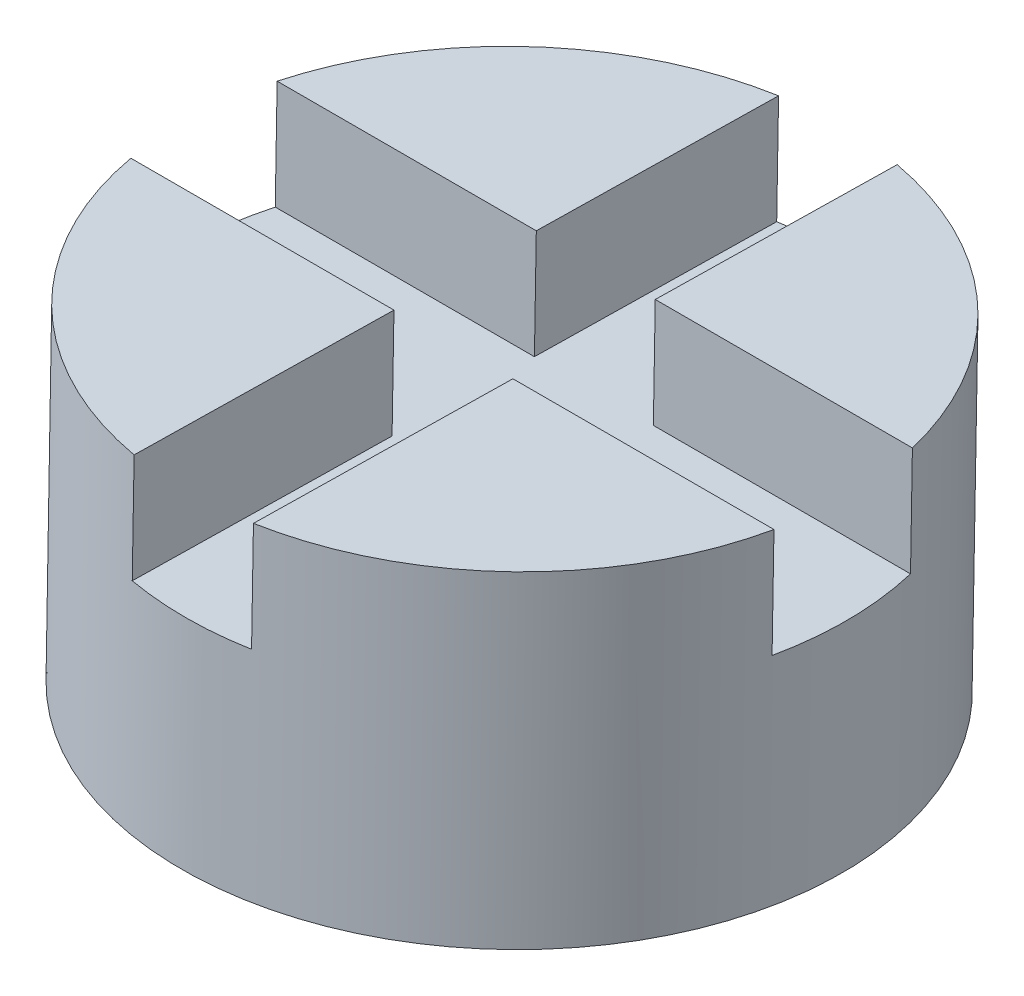
ISO-10303-21;
HEADER;
FILE_DESCRIPTION(('STEP AP214'),'2;1');
FILE_NAME('part.step','',(''),(''),'','','');
FILE_SCHEMA(('AUTOMOTIVE_DESIGN { 1 0 10303 214 1 1 1 1 }'));
ENDSEC;
DATA;
#1=APPLICATION_CONTEXT('core data for automotive mechanical design processes');
#2=APPLICATION_PROTOCOL_DEFINITION('international standard','automotive_design',2000,#1);
#3=PRODUCT_CONTEXT('',#1,'mechanical');
#4=PRODUCT('Part','Part','',(#3));
#5=PRODUCT_RELATED_PRODUCT_CATEGORY('part','',(#4));
#6=PRODUCT_DEFINITION_FORMATION('','',#4);
#7=PRODUCT_DEFINITION_CONTEXT('part definition',#1,'design');
#8=PRODUCT_DEFINITION('design','',#6,#7);
#9=PRODUCT_DEFINITION_SHAPE('','',#8);
#10=(LENGTH_UNIT() NAMED_UNIT(*) SI_UNIT(.MILLI.,.METRE.));
#11=(NAMED_UNIT(*) PLANE_ANGLE_UNIT() SI_UNIT($,.RADIAN.));
#12=(NAMED_UNIT(*) SI_UNIT($,.STERADIAN.) SOLID_ANGLE_UNIT());
#13=UNCERTAINTY_MEASURE_WITH_UNIT(LENGTH_MEASURE(1.E-05),#10,'distance_accuracy_value','');
#14=(GEOMETRIC_REPRESENTATION_CONTEXT(3) GLOBAL_UNCERTAINTY_ASSIGNED_CONTEXT((#13)) GLOBAL_UNIT_ASSIGNED_CONTEXT((#10,
#11,#12)) REPRESENTATION_CONTEXT('',''));
#15=CARTESIAN_POINT('',(0.,0.,0.));
#16=DIRECTION('',(0.,0.,1.));
#17=DIRECTION('',(1.,0.,0.));
#18=AXIS2_PLACEMENT_3D('',#15,#16,#17);
#19=CARTESIAN_POINT('',(0.,42.7310366721,-0.7458730195362));
#20=DIRECTION('',(0.,0.999847695156402,-0.01745240643669));
#21=DIRECTION('',(0.,0.01745240643669,0.999847695156402));
#22=AXIS2_PLACEMENT_3D('',#19,#20,#21);
#23=PLANE('',#22);
#24=DIRECTION('',(1.,0.,0.));
#25=VECTOR('',#24,1.);
#26=CARTESIAN_POINT('',(88.15,42.65438024238,-5.13751693705457));
#27=LINE('',#26,#25);
#28=CARTESIAN_POINT('',(88.15,42.65438024238,-5.13751693705486));
#29=VERTEX_POINT('',#28);
#30=CARTESIAN_POINT('',(85.753357366507,42.6543802423814,-5.1375169370546));
#31=VERTEX_POINT('',#30);
#32=EDGE_CURVE('E183',#29,#31,#27,.F.);
#33=ORIENTED_EDGE('',*,*,#32,.T.);
#34=CARTESIAN_POINT('',(88.69069617612,42.6672853099402,-4.39818611183434));
#35=DIRECTION('',(0.,-0.999847695156402,0.01745240643669));
#36=DIRECTION('',(0.,-0.01745240643669,-0.999847695156402));
#37=AXIS2_PLACEMENT_3D('',#34,#35,#36);
#38=CIRCLE('',#37,3.02898264973);
#39=CARTESIAN_POINT('',(85.7172036385218,42.67735760191,-3.82114489133257));
#40=VERTEX_POINT('',#39);
#41=EDGE_CURVE('E228',#31,#40,#38,.F.);
#42=ORIENTED_EDGE('',*,*,#41,.T.);
#43=DIRECTION('',(1.,0.,0.));
#44=VECTOR('',#43,1.);
#45=CARTESIAN_POINT('',(85.59841520405,42.67735760191,-3.82114489133257));
#46=LINE('',#45,#44);
#47=CARTESIAN_POINT('',(88.15,42.67735760191,-3.82114489133257));
#48=VERTEX_POINT('',#47);
#49=EDGE_CURVE('E187',#40,#48,#46,.T.);
#50=ORIENTED_EDGE('',*,*,#49,.T.);
#51=DIRECTION('',(0.,0.0174524064354115,0.999847695156424));
#52=VECTOR('',#51,1.);
#53=CARTESIAN_POINT('',(88.15,42.67735760191,-3.821144891333));
#54=LINE('',#53,#52);
#55=CARTESIAN_POINT('',(88.15,42.7192992891034,-1.41830724123106));
#56=VERTEX_POINT('',#55);
#57=EDGE_CURVE('E195',#48,#56,#54,.T.);
#58=ORIENTED_EDGE('',*,*,#57,.T.);
#59=CARTESIAN_POINT('',(88.69069617612,42.6672853099439,-4.3981861118344));
#60=DIRECTION('',(0.,-0.999847695156402,0.01745240643669));
#61=DIRECTION('',(0.,-0.01745240643669,-0.999847695156402));
#62=AXIS2_PLACEMENT_3D('',#59,#60,#61);
#63=CIRCLE('',#62,3.02898264973);
#64=CARTESIAN_POINT('',(89.25,42.7192393244823,-1.42174261239896));
#65=VERTEX_POINT('',#64);
#66=EDGE_CURVE('E19',#56,#65,#63,.F.);
#67=ORIENTED_EDGE('',*,*,#66,.T.);
#68=DIRECTION('',(0.,-0.017452406438238,-0.999847695156375));
#69=VECTOR('',#68,1.);
#70=CARTESIAN_POINT('',(89.25,42.71923932448,-1.421742612399));
#71=LINE('',#70,#69);
#72=CARTESIAN_POINT('',(89.25,42.67735760191,-3.82114489133286));
#73=VERTEX_POINT('',#72);
#74=EDGE_CURVE('E198',#65,#73,#71,.T.);
#75=ORIENTED_EDGE('',*,*,#74,.T.);
#76=DIRECTION('',(1.,0.,0.));
#77=VECTOR('',#76,1.);
#78=CARTESIAN_POINT('',(89.25,42.67735760191,-3.82114489133257));
#79=LINE('',#78,#77);
#80=CARTESIAN_POINT('',(91.6641887137182,42.6773576019099,-3.82114489133257));
#81=VERTEX_POINT('',#80);
#82=EDGE_CURVE('E91',#73,#81,#79,.T.);
#83=ORIENTED_EDGE('',*,*,#82,.T.);
#84=CARTESIAN_POINT('',(88.69069617612,42.6672853099372,-4.39818611183428));
#85=DIRECTION('',(0.,-0.999847695156402,0.01745240643669));
#86=DIRECTION('',(0.,-0.01745240643669,-0.999847695156402));
#87=AXIS2_PLACEMENT_3D('',#84,#85,#86);
#88=CIRCLE('',#87,3.02898264973);
#89=CARTESIAN_POINT('',(91.628034985738,42.65438024238,-5.13751693705457));
#90=VERTEX_POINT('',#89);
#91=EDGE_CURVE('E243',#81,#90,#88,.F.);
#92=ORIENTED_EDGE('',*,*,#91,.T.);
#93=DIRECTION('',(1.,0.,0.));
#94=VECTOR('',#93,1.);
#95=CARTESIAN_POINT('',(91.80458459904,42.65438024238,-5.13751693705457));
#96=LINE('',#95,#94);
#97=CARTESIAN_POINT('',(89.25,42.65438024238,-5.13751693705457));
#98=VERTEX_POINT('',#97);
#99=EDGE_CURVE('E129',#90,#98,#96,.F.);
#100=ORIENTED_EDGE('',*,*,#99,.T.);
#101=DIRECTION('',(0.,-0.0174524064327445,-0.999847695156471));
#102=VECTOR('',#101,1.);
#103=CARTESIAN_POINT('',(89.25,42.65438024238,-5.137516937055));
#104=LINE('',#103,#102);
#105=CARTESIAN_POINT('',(89.25,42.6153312954127,-7.37462961127004));
#106=VERTEX_POINT('',#105);
#107=EDGE_CURVE('E126',#98,#106,#104,.T.);
#108=ORIENTED_EDGE('',*,*,#107,.T.);
#109=CARTESIAN_POINT('',(88.69069617612,42.6672853099428,-4.39818611183438));
#110=DIRECTION('',(0.,-0.999847695156402,0.01745240643669));
#111=DIRECTION('',(0.,-0.01745240643669,-0.999847695156402));
#112=AXIS2_PLACEMENT_3D('',#109,#110,#111);
#113=CIRCLE('',#112,3.02898264973);
#114=CARTESIAN_POINT('',(88.15,42.6152713307837,-7.37806498243776));
#115=VERTEX_POINT('',#114);
#116=EDGE_CURVE('E242',#106,#115,#113,.F.);
#117=ORIENTED_EDGE('',*,*,#116,.T.);
#118=DIRECTION('',(0.,0.0174524064341855,0.999847695156445));
#119=VECTOR('',#118,1.);
#120=CARTESIAN_POINT('',(88.15,42.61527133078,-7.378064982438));
#121=LINE('',#120,#119);
#122=EDGE_CURVE('E175',#115,#29,#121,.T.);
#123=ORIENTED_EDGE('',*,*,#122,.T.);
#124=EDGE_LOOP('',(#33,#42,#50,#58,#67,#75,#83,#92,#100,#108,#117,#123));
#125=FACE_BOUND('',#124,.T.);
#126=ADVANCED_FACE('F16',(#125),#23,.T.);
#127=CARTESIAN_POINT('',(89.25,44.28236767054,-3.84916044629));
#128=DIRECTION('',(0.,0.01745240643669,0.999847695156402));
#129=DIRECTION('',(0.,-0.999847695156402,0.01745240643669));
#130=AXIS2_PLACEMENT_3D('',#127,#128,#129);
#131=PLANE('',#130);
#132=ORIENTED_EDGE('',*,*,#82,.F.);
#133=DIRECTION('',(0.,0.999847695156397,-0.0174524064369369));
#134=VECTOR('',#133,1.);
#135=CARTESIAN_POINT('',(89.25,42.67735760191,-3.821144891333));
#136=LINE('',#135,#134);
#137=CARTESIAN_POINT('',(89.25,43.6772052970677,-3.83859729776996));
#138=VERTEX_POINT('',#137);
#139=EDGE_CURVE('E200',#73,#138,#136,.T.);
#140=ORIENTED_EDGE('',*,*,#139,.T.);
#141=DIRECTION('',(1.,0.,0.));
#142=VECTOR('',#141,1.);
#143=CARTESIAN_POINT('',(0.,43.6772052970677,-3.83859729776996));
#144=LINE('',#143,#142);
#145=CARTESIAN_POINT('',(91.6641887137183,43.6772052970689,-3.83859729776981));
#146=VERTEX_POINT('',#145);
#147=EDGE_CURVE('E128',#146,#138,#144,.F.);
#148=ORIENTED_EDGE('',*,*,#147,.F.);
#149=DIRECTION('',(0.,-0.999847695156402,0.01745240643669));
#150=VECTOR('',#149,1.);
#151=CARTESIAN_POINT('',(91.66418871372,44.28236767054,-3.84916044629));
#152=LINE('',#151,#150);
#153=EDGE_CURVE('E199',#81,#146,#152,.F.);
#154=ORIENTED_EDGE('',*,*,#153,.F.);
#155=EDGE_LOOP('',(#132,#140,#148,#154));
#156=FACE_BOUND('',#155,.T.);
#157=ADVANCED_FACE('F255',(#156),#131,.F.);
#158=CARTESIAN_POINT('',(89.25,44.32693825663,-1.295713278994));
#159=DIRECTION('',(1.,0.,0.));
#160=DIRECTION('',(0.,0.,-1.));
#161=AXIS2_PLACEMENT_3D('',#158,#159,#160);
#162=PLANE('',#161);
#163=ORIENTED_EDGE('',*,*,#74,.F.);
#164=DIRECTION('',(0.,-0.999847695156412,0.0174524064361119));
#165=VECTOR('',#164,1.);
#166=CARTESIAN_POINT('',(89.25,43.71908701963,-1.439195018835));
#167=LINE('',#166,#165);
#168=CARTESIAN_POINT('',(89.25,43.7190870196351,-1.4391950188353));
#169=VERTEX_POINT('',#168);
#170=EDGE_CURVE('E196',#169,#65,#167,.T.);
#171=ORIENTED_EDGE('',*,*,#170,.F.);
#172=DIRECTION('',(0.,0.01745240643669,0.999847695156402));
#173=VECTOR('',#172,1.);
#174=CARTESIAN_POINT('',(89.25,43.73088436726,-0.7633254259729));
#175=LINE('',#174,#173);
#176=EDGE_CURVE('E157',#138,#169,#175,.T.);
#177=ORIENTED_EDGE('',*,*,#176,.F.);
#178=ORIENTED_EDGE('',*,*,#139,.F.);
#179=EDGE_LOOP('',(#163,#171,#177,#178));
#180=FACE_BOUND('',#179,.T.);
#181=ADVANCED_FACE('F247',(#180),#162,.F.);
#182=CARTESIAN_POINT('',(88.15,44.28236767054,-3.84916044629));
#183=DIRECTION('',(-1.,0.,0.));
#184=DIRECTION('',(0.,0.,1.));
#185=AXIS2_PLACEMENT_3D('',#182,#183,#184);
#186=PLANE('',#185);
#187=ORIENTED_EDGE('',*,*,#57,.F.);
#188=DIRECTION('',(0.,-0.999847695156402,0.01745240643669));
#189=VECTOR('',#188,1.);
#190=CARTESIAN_POINT('',(88.15,44.28236767054,-3.84916044629));
#191=LINE('',#190,#189);
#192=CARTESIAN_POINT('',(88.15,43.6772052970677,-3.83859729776974));
#193=VERTEX_POINT('',#192);
#194=EDGE_CURVE('E189',#48,#193,#191,.F.);
#195=ORIENTED_EDGE('',*,*,#194,.T.);
#196=DIRECTION('',(0.,0.01745240643669,0.999847695156402));
#197=VECTOR('',#196,1.);
#198=CARTESIAN_POINT('',(88.15,43.73088436726,-0.7633254259729));
#199=LINE('',#198,#197);
#200=CARTESIAN_POINT('',(88.15,43.7191469842604,-1.43575964766802));
#201=VERTEX_POINT('',#200);
#202=EDGE_CURVE('E153',#201,#193,#199,.F.);
#203=ORIENTED_EDGE('',*,*,#202,.F.);
#204=DIRECTION('',(0.,0.999847695156397,-0.0174524064369369));
#205=VECTOR('',#204,1.);
#206=CARTESIAN_POINT('',(88.15,42.7192992891,-1.418307241231));
#207=LINE('',#206,#205);
#208=EDGE_CURVE('E188',#56,#201,#207,.T.);
#209=ORIENTED_EDGE('',*,*,#208,.F.);
#210=EDGE_LOOP('',(#187,#195,#203,#209));
#211=FACE_BOUND('',#210,.T.);
#212=ADVANCED_FACE('F262',(#211),#186,.F.);
#213=CARTESIAN_POINT('',(85.59841520405,44.28236767054,-3.84916044629));
#214=DIRECTION('',(0.,0.01745240643669,0.999847695156402));
#215=DIRECTION('',(0.,-0.999847695156402,0.01745240643669));
#216=AXIS2_PLACEMENT_3D('',#213,#214,#215);
#217=PLANE('',#216);
#218=ORIENTED_EDGE('',*,*,#49,.F.);
#219=DIRECTION('',(0.,-0.999847695156402,0.01745240643669));
#220=VECTOR('',#219,1.);
#221=CARTESIAN_POINT('',(85.71720363852,44.28236767054,-3.84916044629));
#222=LINE('',#221,#220);
#223=CARTESIAN_POINT('',(85.7172036385217,43.6772052970673,-3.83859729776978));
#224=VERTEX_POINT('',#223);
#225=EDGE_CURVE('E184',#224,#40,#222,.T.);
#226=ORIENTED_EDGE('',*,*,#225,.F.);
#227=DIRECTION('',(1.,0.,0.));
#228=VECTOR('',#227,1.);
#229=CARTESIAN_POINT('',(0.,43.6772052970677,-3.83859729776996));
#230=LINE('',#229,#228);
#231=EDGE_CURVE('E148',#193,#224,#230,.F.);
#232=ORIENTED_EDGE('',*,*,#231,.F.);
#233=ORIENTED_EDGE('',*,*,#194,.F.);
#234=EDGE_LOOP('',(#218,#226,#232,#233));
#235=FACE_BOUND('',#234,.T.);
#236=ADVANCED_FACE('F297',(#235),#217,.F.);
#237=CARTESIAN_POINT('',(88.15,44.25939031101,-5.165532492012));
#238=DIRECTION('',(0.,-0.01745240643669,-0.999847695156402));
#239=DIRECTION('',(0.,0.999847695156402,-0.01745240643669));
#240=AXIS2_PLACEMENT_3D('',#237,#238,#239);
#241=PLANE('',#240);
#242=ORIENTED_EDGE('',*,*,#32,.F.);
#243=DIRECTION('',(0.,0.999847695156397,-0.0174524064369378));
#244=VECTOR('',#243,1.);
#245=CARTESIAN_POINT('',(88.15,42.65438024238,-5.137516937055));
#246=LINE('',#245,#244);
#247=CARTESIAN_POINT('',(88.15,43.6542279375407,-5.15496934349201));
#248=VERTEX_POINT('',#247);
#249=EDGE_CURVE('E177',#29,#248,#246,.T.);
#250=ORIENTED_EDGE('',*,*,#249,.T.);
#251=DIRECTION('',(1.,0.,0.));
#252=VECTOR('',#251,1.);
#253=CARTESIAN_POINT('',(0.,43.6542279375407,-5.15496934349201));
#254=LINE('',#253,#252);
#255=CARTESIAN_POINT('',(85.7533573665071,43.6542279375404,-5.15496934349184));
#256=VERTEX_POINT('',#255);
#257=EDGE_CURVE('E144',#256,#248,#254,.T.);
#258=ORIENTED_EDGE('',*,*,#257,.F.);
#259=DIRECTION('',(0.,0.999847695156402,-0.01745240643669));
#260=VECTOR('',#259,1.);
#261=CARTESIAN_POINT('',(85.75335736651,44.25939031101,-5.165532492012));
#262=LINE('',#261,#260);
#263=EDGE_CURVE('E176',#31,#256,#262,.T.);
#264=ORIENTED_EDGE('',*,*,#263,.F.);
#265=EDGE_LOOP('',(#242,#250,#258,#264));
#266=FACE_BOUND('',#265,.T.);
#267=ADVANCED_FACE('F293',(#266),#241,.F.);
#268=CARTESIAN_POINT('',(88.15,44.21711332258,-7.587579537057));
#269=DIRECTION('',(-1.,0.,0.));
#270=DIRECTION('',(0.,0.,1.));
#271=AXIS2_PLACEMENT_3D('',#268,#269,#270);
#272=PLANE('',#271);
#273=ORIENTED_EDGE('',*,*,#122,.F.);
#274=DIRECTION('',(0.,-0.999847695156415,0.0174524064359371));
#275=VECTOR('',#274,1.);
#276=CARTESIAN_POINT('',(88.15,43.61511902594,-7.395517388874));
#277=LINE('',#276,#275);
#278=CARTESIAN_POINT('',(88.15,43.6151190259347,-7.39551738887398));
#279=VERTEX_POINT('',#278);
#280=EDGE_CURVE('E172',#279,#115,#277,.T.);
#281=ORIENTED_EDGE('',*,*,#280,.F.);
#282=DIRECTION('',(0.,0.01745240643669,0.999847695156402));
#283=VECTOR('',#282,1.);
#284=CARTESIAN_POINT('',(88.15,43.73088436726,-0.7633254259729));
#285=LINE('',#284,#283);
#286=EDGE_CURVE('E120',#248,#279,#285,.F.);
#287=ORIENTED_EDGE('',*,*,#286,.F.);
#288=ORIENTED_EDGE('',*,*,#249,.F.);
#289=EDGE_LOOP('',(#273,#281,#287,#288));
#290=FACE_BOUND('',#289,.T.);
#291=ADVANCED_FACE('F290',(#290),#272,.F.);
#292=CARTESIAN_POINT('',(89.25,44.25939031101,-5.165532492012));
#293=DIRECTION('',(1.,0.,0.));
#294=DIRECTION('',(0.,0.,-1.));
#295=AXIS2_PLACEMENT_3D('',#292,#293,#294);
#296=PLANE('',#295);
#297=ORIENTED_EDGE('',*,*,#107,.F.);
#298=DIRECTION('',(0.,0.999847695156402,-0.01745240643669));
#299=VECTOR('',#298,1.);
#300=CARTESIAN_POINT('',(89.25,44.25939031101,-5.165532492012));
#301=LINE('',#300,#299);
#302=CARTESIAN_POINT('',(89.25,43.6542279375407,-5.15496934349179));
#303=VERTEX_POINT('',#302);
#304=EDGE_CURVE('E123',#98,#303,#301,.T.);
#305=ORIENTED_EDGE('',*,*,#304,.T.);
#306=DIRECTION('',(0.,0.01745240643669,0.999847695156402));
#307=VECTOR('',#306,1.);
#308=CARTESIAN_POINT('',(89.25,43.73088436726,-0.7633254259729));
#309=LINE('',#308,#307);
#310=CARTESIAN_POINT('',(89.25,43.6151789905609,-7.3920820177068));
#311=VERTEX_POINT('',#310);
#312=EDGE_CURVE('E113',#311,#303,#309,.T.);
#313=ORIENTED_EDGE('',*,*,#312,.F.);
#314=DIRECTION('',(0.,0.999847695156394,-0.0174524064371123));
#315=VECTOR('',#314,1.);
#316=CARTESIAN_POINT('',(89.25,42.61533129541,-7.37462961127));
#317=LINE('',#316,#315);
#318=EDGE_CURVE('E167',#106,#311,#317,.T.);
#319=ORIENTED_EDGE('',*,*,#318,.F.);
#320=EDGE_LOOP('',(#297,#305,#313,#319));
#321=FACE_BOUND('',#320,.T.);
#322=ADVANCED_FACE('F124',(#321),#296,.F.);
#323=CARTESIAN_POINT('',(91.80458459904,44.25939031101,-5.165532492012));
#324=DIRECTION('',(0.,-0.01745240643669,-0.999847695156402));
#325=DIRECTION('',(0.,0.999847695156402,-0.01745240643669));
#326=AXIS2_PLACEMENT_3D('',#323,#324,#325);
#327=PLANE('',#326);
#328=ORIENTED_EDGE('',*,*,#99,.F.);
#329=DIRECTION('',(0.,0.999847695156402,-0.01745240643669));
#330=VECTOR('',#329,1.);
#331=CARTESIAN_POINT('',(91.62803498574,44.25939031101,-5.165532492012));
#332=LINE('',#331,#330);
#333=CARTESIAN_POINT('',(91.6280349857379,43.6542279375398,-5.15496934349183));
#334=VERTEX_POINT('',#333);
#335=EDGE_CURVE('E34',#334,#90,#332,.F.);
#336=ORIENTED_EDGE('',*,*,#335,.F.);
#337=DIRECTION('',(1.,0.,0.));
#338=VECTOR('',#337,1.);
#339=CARTESIAN_POINT('',(0.,43.6542279375407,-5.15496934349201));
#340=LINE('',#339,#338);
#341=EDGE_CURVE('E116',#303,#334,#340,.T.);
#342=ORIENTED_EDGE('',*,*,#341,.F.);
#343=ORIENTED_EDGE('',*,*,#304,.F.);
#344=EDGE_LOOP('',(#328,#336,#342,#343));
#345=FACE_BOUND('',#344,.T.);
#346=ADVANCED_FACE('F131',(#345),#327,.F.);
#347=CARTESIAN_POINT('',(0.,43.73088436726,-0.7633254259729));
#348=DIRECTION('',(0.,0.999847695156402,-0.01745240643669));
#349=DIRECTION('',(0.,0.01745240643669,0.999847695156402));
#350=AXIS2_PLACEMENT_3D('',#347,#348,#349);
#351=PLANE('',#350);
#352=ORIENTED_EDGE('',*,*,#147,.T.);
#353=ORIENTED_EDGE('',*,*,#176,.T.);
#354=CARTESIAN_POINT('',(88.69069617612,43.6671330051002,-4.41563851827109));
#355=DIRECTION('',(0.,-0.999847695156402,0.01745240643669));
#356=DIRECTION('',(0.,-0.01745240643669,-0.999847695156402));
#357=AXIS2_PLACEMENT_3D('',#354,#355,#356);
#358=CIRCLE('',#357,3.02898264973);
#359=EDGE_CURVE('E132',#146,#169,#358,.T.);
#360=ORIENTED_EDGE('',*,*,#359,.F.);
#361=EDGE_LOOP('',(#352,#353,#360));
#362=FACE_BOUND('',#361,.T.);
#363=ADVANCED_FACE('F254',(#362),#351,.T.);
#364=CARTESIAN_POINT('',(0.,43.73088436726,-0.7633254259729));
#365=DIRECTION('',(0.,0.999847695156402,-0.01745240643669));
#366=DIRECTION('',(0.,0.01745240643669,0.999847695156402));
#367=AXIS2_PLACEMENT_3D('',#364,#365,#366);
#368=PLANE('',#367);
#369=ORIENTED_EDGE('',*,*,#202,.T.);
#370=ORIENTED_EDGE('',*,*,#231,.T.);
#371=CARTESIAN_POINT('',(88.69069617612,43.6671330050972,-4.41563851827104));
#372=DIRECTION('',(0.,-0.999847695156402,0.01745240643669));
#373=DIRECTION('',(0.,-0.01745240643669,-0.999847695156402));
#374=AXIS2_PLACEMENT_3D('',#371,#372,#373);
#375=CIRCLE('',#374,3.02898264973);
#376=EDGE_CURVE('E135',#201,#224,#375,.T.);
#377=ORIENTED_EDGE('',*,*,#376,.F.);
#378=EDGE_LOOP('',(#369,#370,#377));
#379=FACE_BOUND('',#378,.T.);
#380=ADVANCED_FACE('F279',(#379),#368,.T.);
#381=CARTESIAN_POINT('',(0.,43.73088436726,-0.7633254259729));
#382=DIRECTION('',(0.,0.999847695156402,-0.01745240643669));
#383=DIRECTION('',(0.,0.01745240643669,0.999847695156402));
#384=AXIS2_PLACEMENT_3D('',#381,#382,#383);
#385=PLANE('',#384);
#386=ORIENTED_EDGE('',*,*,#257,.T.);
#387=ORIENTED_EDGE('',*,*,#286,.T.);
#388=CARTESIAN_POINT('',(88.69069617612,43.6671330050972,-4.41563851827104));
#389=DIRECTION('',(0.,-0.999847695156402,0.01745240643669));
#390=DIRECTION('',(0.,-0.01745240643669,-0.999847695156402));
#391=AXIS2_PLACEMENT_3D('',#388,#389,#390);
#392=CIRCLE('',#391,3.02898264973);
#393=EDGE_CURVE('E236',#256,#279,#392,.T.);
#394=ORIENTED_EDGE('',*,*,#393,.F.);
#395=EDGE_LOOP('',(#386,#387,#394));
#396=FACE_BOUND('',#395,.T.);
#397=ADVANCED_FACE('F276',(#396),#385,.T.);
#398=CARTESIAN_POINT('',(0.,43.73088436726,-0.7633254259729));
#399=DIRECTION('',(0.,0.999847695156402,-0.01745240643669));
#400=DIRECTION('',(0.,0.01745240643669,0.999847695156402));
#401=AXIS2_PLACEMENT_3D('',#398,#399,#400);
#402=PLANE('',#401);
#403=ORIENTED_EDGE('',*,*,#312,.T.);
#404=ORIENTED_EDGE('',*,*,#341,.T.);
#405=CARTESIAN_POINT('',(88.69069617612,43.6671330050961,-4.41563851827101));
#406=DIRECTION('',(0.,-0.999847695156402,0.01745240643669));
#407=DIRECTION('',(0.,-0.01745240643669,-0.999847695156402));
#408=AXIS2_PLACEMENT_3D('',#405,#406,#407);
#409=CIRCLE('',#408,3.02898264973);
#410=EDGE_CURVE('E25',#311,#334,#409,.T.);
#411=ORIENTED_EDGE('',*,*,#410,.F.);
#412=EDGE_LOOP('',(#403,#404,#411));
#413=FACE_BOUND('',#412,.T.);
#414=ADVANCED_FACE('F115',(#413),#402,.T.);
#415=CARTESIAN_POINT('',(88.69069617612,40.66758991963,-4.363281298961));
#416=DIRECTION('',(0.,-0.999847695156402,0.01745240643669));
#417=DIRECTION('',(0.,-0.01745240643669,-0.999847695156402));
#418=AXIS2_PLACEMENT_3D('',#415,#416,#417);
#419=CYLINDRICAL_SURFACE('',#418,3.02898264973);
#420=ORIENTED_EDGE('',*,*,#41,.F.);
#421=ORIENTED_EDGE('',*,*,#263,.T.);
#422=ORIENTED_EDGE('',*,*,#393,.T.);
#423=ORIENTED_EDGE('',*,*,#280,.T.);
#424=ORIENTED_EDGE('',*,*,#116,.F.);
#425=ORIENTED_EDGE('',*,*,#318,.T.);
#426=ORIENTED_EDGE('',*,*,#410,.T.);
#427=ORIENTED_EDGE('',*,*,#335,.T.);
#428=ORIENTED_EDGE('',*,*,#91,.F.);
#429=ORIENTED_EDGE('',*,*,#153,.T.);
#430=ORIENTED_EDGE('',*,*,#359,.T.);
#431=ORIENTED_EDGE('',*,*,#170,.T.);
#432=ORIENTED_EDGE('',*,*,#66,.F.);
#433=ORIENTED_EDGE('',*,*,#208,.T.);
#434=ORIENTED_EDGE('',*,*,#376,.T.);
#435=ORIENTED_EDGE('',*,*,#225,.T.);
#436=EDGE_LOOP('',(#420,#421,#422,#423,#424,#425,#426,#427,#428,#429,#430,#431,#432,#433,#434,#435));
#437=FACE_BOUND('',#436,.T.);
#438=CARTESIAN_POINT('',(88.69069617612,40.66758991963,-4.363281298961));
#439=DIRECTION('',(0.,-0.999847695156402,0.01745240643669));
#440=DIRECTION('',(0.,-0.01745240643669,-0.999847695156402));
#441=AXIS2_PLACEMENT_3D('',#438,#439,#440);
#442=CIRCLE('',#441,3.02898264973);
#443=CARTESIAN_POINT('',(88.69069617612,40.6147268833372,-7.39180261996227));
#444=VERTEX_POINT('',#443);
#445=EDGE_CURVE('E11',#444,#444,#442,.F.);
#446=ORIENTED_EDGE('',*,*,#445,.T.);
#447=EDGE_LOOP('',(#446));
#448=FACE_BOUND('',#447,.T.);
#449=ADVANCED_FACE('F249',(#437,#448),#419,.T.);
#450=CARTESIAN_POINT('',(0.,40.73134128179,-0.7109682066629));
#451=DIRECTION('',(0.,0.999847695156402,-0.01745240643669));
#452=DIRECTION('',(0.,0.01745240643669,0.999847695156402));
#453=AXIS2_PLACEMENT_3D('',#450,#451,#452);
#454=PLANE('',#453);
#455=ORIENTED_EDGE('',*,*,#445,.F.);
#456=EDGE_LOOP('',(#455));
#457=FACE_BOUND('',#456,.T.);
#458=ADVANCED_FACE('F264',(#457),#454,.F.);
#459=CLOSED_SHELL('',(#126,#157,#181,#212,#236,#267,#291,#322,#346,#363,#380,#397,#414,#449,#458));
#460=MANIFOLD_SOLID_BREP('B1',#459);
#461=ADVANCED_BREP_SHAPE_REPRESENTATION('',(#18,#460),#14);
#462=SHAPE_DEFINITION_REPRESENTATION(#9,#461);
ENDSEC;
END-ISO-10303-21;
